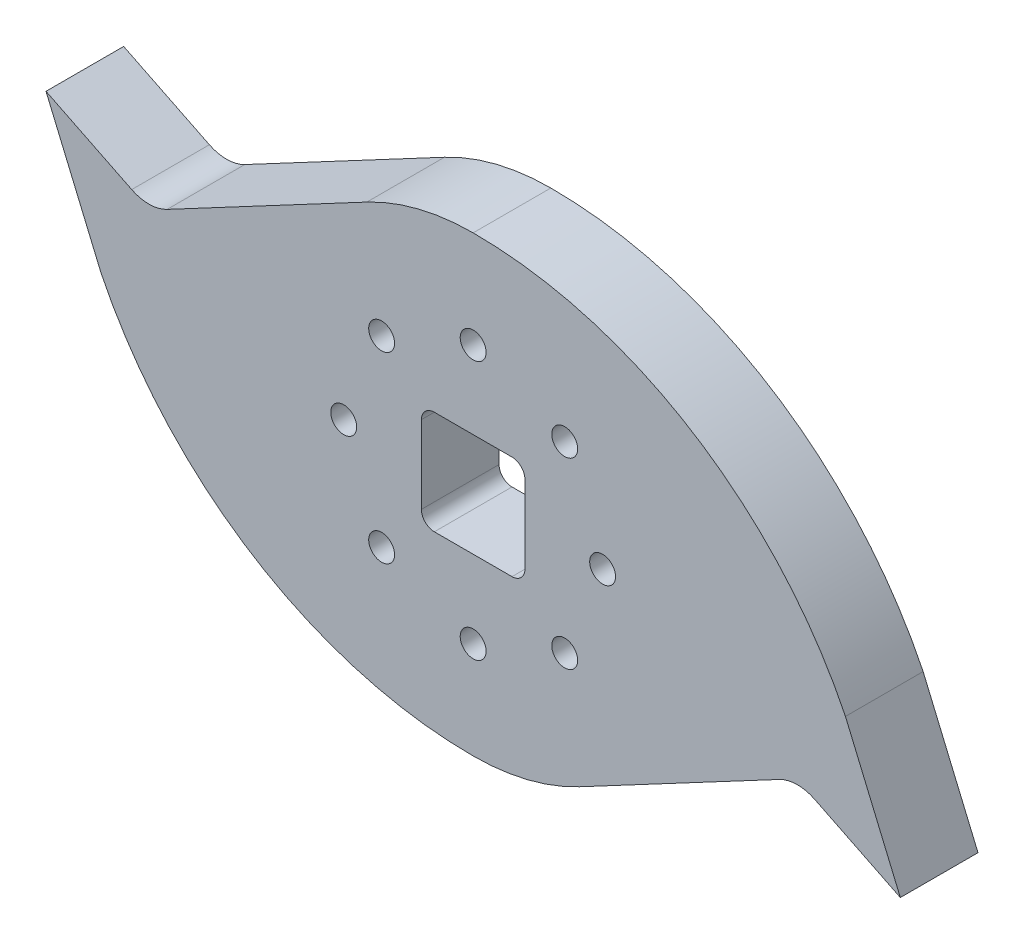
ISO-10303-21;
HEADER;
FILE_DESCRIPTION(('STEP AP214'),'2;1');
FILE_NAME('part.step','',(''),(''),'','','');
FILE_SCHEMA(('AUTOMOTIVE_DESIGN { 1 0 10303 214 1 1 1 1 }'));
ENDSEC;
DATA;
#1=APPLICATION_CONTEXT('core data for automotive mechanical design processes');
#2=APPLICATION_PROTOCOL_DEFINITION('international standard','automotive_design',2000,#1);
#3=PRODUCT_CONTEXT('',#1,'mechanical');
#4=PRODUCT('Part','Part','',(#3));
#5=PRODUCT_RELATED_PRODUCT_CATEGORY('part','',(#4));
#6=PRODUCT_DEFINITION_FORMATION('','',#4);
#7=PRODUCT_DEFINITION_CONTEXT('part definition',#1,'design');
#8=PRODUCT_DEFINITION('design','',#6,#7);
#9=PRODUCT_DEFINITION_SHAPE('','',#8);
#10=(LENGTH_UNIT() NAMED_UNIT(*) SI_UNIT(.MILLI.,.METRE.));
#11=(NAMED_UNIT(*) PLANE_ANGLE_UNIT() SI_UNIT($,.RADIAN.));
#12=(NAMED_UNIT(*) SI_UNIT($,.STERADIAN.) SOLID_ANGLE_UNIT());
#13=UNCERTAINTY_MEASURE_WITH_UNIT(LENGTH_MEASURE(1.E-05),#10,'distance_accuracy_value','');
#14=(GEOMETRIC_REPRESENTATION_CONTEXT(3) GLOBAL_UNCERTAINTY_ASSIGNED_CONTEXT((#13)) GLOBAL_UNIT_ASSIGNED_CONTEXT((#10,
#11,#12)) REPRESENTATION_CONTEXT('',''));
#15=CARTESIAN_POINT('',(0.,0.,0.));
#16=DIRECTION('',(0.,0.,1.));
#17=DIRECTION('',(1.,0.,0.));
#18=AXIS2_PLACEMENT_3D('',#15,#16,#17);
#19=CARTESIAN_POINT('',(0.,0.,6.));
#20=DIRECTION('',(0.,0.,1.));
#21=DIRECTION('',(1.,0.,0.));
#22=AXIS2_PLACEMENT_3D('',#19,#20,#21);
#23=PLANE('',#22);
#24=CARTESIAN_POINT('',(0.,10.,6.));
#25=DIRECTION('',(0.,0.,1.));
#26=DIRECTION('',(1.,0.,0.));
#27=AXIS2_PLACEMENT_3D('',#24,#25,#26);
#28=CIRCLE('',#27,1.);
#29=CARTESIAN_POINT('',(1.,10.,6.));
#30=VERTEX_POINT('',#29);
#31=EDGE_CURVE('E718',#30,#30,#28,.T.);
#32=ORIENTED_EDGE('',*,*,#31,.F.);
#33=EDGE_LOOP('',(#32));
#34=FACE_BOUND('',#33,.T.);
#35=CARTESIAN_POINT('',(7.0710678118656,7.07106781186578,6.));
#36=DIRECTION('',(0.,0.,1.));
#37=DIRECTION('',(1.,0.,0.));
#38=AXIS2_PLACEMENT_3D('',#35,#36,#37);
#39=CIRCLE('',#38,1.00000000000005);
#40=CARTESIAN_POINT('',(8.07106781186565,7.07106781186578,6.));
#41=VERTEX_POINT('',#40);
#42=EDGE_CURVE('E726',#41,#41,#39,.T.);
#43=ORIENTED_EDGE('',*,*,#42,.F.);
#44=EDGE_LOOP('',(#43));
#45=FACE_BOUND('',#44,.T.);
#46=CARTESIAN_POINT('',(10.0000000000004,4.24488671257339E-13,6.));
#47=DIRECTION('',(0.,0.,1.));
#48=DIRECTION('',(1.,0.,0.));
#49=AXIS2_PLACEMENT_3D('',#46,#47,#48);
#50=CIRCLE('',#49,1.00000000000032);
#51=CARTESIAN_POINT('',(11.0000000000007,4.24488671257339E-13,6.));
#52=VERTEX_POINT('',#51);
#53=EDGE_CURVE('E736',#52,#52,#50,.T.);
#54=ORIENTED_EDGE('',*,*,#53,.F.);
#55=EDGE_LOOP('',(#54));
#56=FACE_BOUND('',#55,.T.);
#57=CARTESIAN_POINT('',(7.0710678118662,-7.07106781186517,6.));
#58=DIRECTION('',(0.,0.,1.));
#59=DIRECTION('',(1.,0.,0.));
#60=AXIS2_PLACEMENT_3D('',#57,#58,#59);
#61=CIRCLE('',#60,1.00000000000066);
#62=CARTESIAN_POINT('',(8.07106781186686,-7.07106781186517,6.));
#63=VERTEX_POINT('',#62);
#64=EDGE_CURVE('E744',#63,#63,#61,.T.);
#65=ORIENTED_EDGE('',*,*,#64,.F.);
#66=EDGE_LOOP('',(#65));
#67=FACE_BOUND('',#66,.T.);
#68=CARTESIAN_POINT('',(8.48977342514678E-13,-10.,6.));
#69=DIRECTION('',(0.,0.,1.));
#70=DIRECTION('',(1.,0.,0.));
#71=AXIS2_PLACEMENT_3D('',#68,#69,#70);
#72=CIRCLE('',#71,1.00000000000088);
#73=CARTESIAN_POINT('',(1.00000000000173,-10.,6.));
#74=VERTEX_POINT('',#73);
#75=EDGE_CURVE('E752',#74,#74,#72,.T.);
#76=ORIENTED_EDGE('',*,*,#75,.F.);
#77=EDGE_LOOP('',(#76));
#78=FACE_BOUND('',#77,.T.);
#79=CARTESIAN_POINT('',(-7.07106781186475,-7.07106781186578,6.));
#80=DIRECTION('',(0.,0.,1.));
#81=DIRECTION('',(1.,0.,0.));
#82=AXIS2_PLACEMENT_3D('',#79,#80,#81);
#83=CIRCLE('',#82,1.00000000000086);
#84=CARTESIAN_POINT('',(-6.07106781186389,-7.07106781186578,6.));
#85=VERTEX_POINT('',#84);
#86=EDGE_CURVE('E760',#85,#85,#83,.T.);
#87=ORIENTED_EDGE('',*,*,#86,.F.);
#88=EDGE_LOOP('',(#87));
#89=FACE_BOUND('',#88,.T.);
#90=CARTESIAN_POINT('',(-9.99999999999958,-4.25713318056486E-13,6.));
#91=DIRECTION('',(0.,0.,1.));
#92=DIRECTION('',(1.,0.,0.));
#93=AXIS2_PLACEMENT_3D('',#90,#91,#92);
#94=CIRCLE('',#93,1.00000000000063);
#95=CARTESIAN_POINT('',(-8.99999999999895,-4.25713318056486E-13,6.));
#96=VERTEX_POINT('',#95);
#97=EDGE_CURVE('E768',#96,#96,#94,.T.);
#98=ORIENTED_EDGE('',*,*,#97,.F.);
#99=EDGE_LOOP('',(#98));
#100=FACE_BOUND('',#99,.T.);
#101=CARTESIAN_POINT('',(-7.07106781186535,7.07106781186517,6.));
#102=DIRECTION('',(0.,0.,1.));
#103=DIRECTION('',(1.,0.,0.));
#104=AXIS2_PLACEMENT_3D('',#101,#102,#103);
#105=CIRCLE('',#104,1.00000000000033);
#106=CARTESIAN_POINT('',(-6.07106781186503,7.07106781186517,6.));
#107=VERTEX_POINT('',#106);
#108=EDGE_CURVE('E775',#107,#107,#105,.T.);
#109=ORIENTED_EDGE('',*,*,#108,.F.);
#110=EDGE_LOOP('',(#109));
#111=FACE_BOUND('',#110,.T.);
#112=CARTESIAN_POINT('',(0.,0.,6.));
#113=DIRECTION('',(0.,0.,1.));
#114=DIRECTION('',(1.,0.,0.));
#115=AXIS2_PLACEMENT_3D('',#112,#113,#114);
#116=CIRCLE('',#115,17.5);
#117=CARTESIAN_POINT('',(0.,17.5,6.));
#118=VERTEX_POINT('',#117);
#119=CARTESIAN_POINT('',(-8.215752348753,15.4515828750313,6.));
#120=VERTEX_POINT('',#119);
#121=EDGE_CURVE('E270',#118,#120,#116,.T.);
#122=ORIENTED_EDGE('',*,*,#121,.T.);
#123=DIRECTION('',(-0.882947592858926,-0.469471562785892,0.));
#124=VECTOR('',#123,1.);
#125=CARTESIAN_POINT('',(-8.215752348753,15.4515828750313,6.));
#126=LINE('',#125,#124);
#127=CARTESIAN_POINT('',(-23.6433380172678,7.24859006731649,6.));
#128=VERTEX_POINT('',#127);
#129=EDGE_CURVE('E274',#120,#128,#126,.T.);
#130=ORIENTED_EDGE('',*,*,#129,.T.);
#131=CARTESIAN_POINT('',(-25.0517527056254,9.89743284589327,6.));
#132=DIRECTION('',(0.,0.,-1.));
#133=DIRECTION('',(-1.,0.,0.));
#134=AXIS2_PLACEMENT_3D('',#131,#132,#133);
#135=CIRCLE('',#134,3.);
#136=CARTESIAN_POINT('',(-26.3781712013609,7.20659394804545,6.));
#137=VERTEX_POINT('',#136);
#138=EDGE_CURVE('E278',#128,#137,#135,.T.);
#139=ORIENTED_EDGE('',*,*,#138,.T.);
#140=DIRECTION('',(-0.896946299282606,0.44213949857849,0.));
#141=VECTOR('',#140,1.);
#142=CARTESIAN_POINT('',(-33.,10.4707493016542,6.));
#143=LINE('',#142,#141);
#144=CARTESIAN_POINT('',(-33.,10.4707493016542,6.));
#145=VERTEX_POINT('',#144);
#146=EDGE_CURVE('E281',#137,#145,#143,.T.);
#147=ORIENTED_EDGE('',*,*,#146,.T.);
#148=DIRECTION('',(0.390302996190186,-0.920686467351923,0.));
#149=VECTOR('',#148,1.);
#150=CARTESIAN_POINT('',(-28.7607392958346,0.47074930165422,6.));
#151=LINE('',#150,#149);
#152=CARTESIAN_POINT('',(-28.7607392958346,0.47074930165421,6.));
#153=VERTEX_POINT('',#152);
#154=EDGE_CURVE('E284',#145,#153,#151,.T.);
#155=ORIENTED_EDGE('',*,*,#154,.T.);
#156=CARTESIAN_POINT('',(0.,14.5,6.));
#157=DIRECTION('',(0.,0.,1.));
#158=DIRECTION('',(-1.,0.,0.));
#159=AXIS2_PLACEMENT_3D('',#156,#157,#158);
#160=CIRCLE('',#159,32.);
#161=CARTESIAN_POINT('',(0.,-17.5,6.));
#162=VERTEX_POINT('',#161);
#163=EDGE_CURVE('E287',#153,#162,#160,.T.);
#164=ORIENTED_EDGE('',*,*,#163,.T.);
#165=CARTESIAN_POINT('',(0.,0.,6.));
#166=DIRECTION('',(0.,0.,1.));
#167=DIRECTION('',(1.,0.,0.));
#168=AXIS2_PLACEMENT_3D('',#165,#166,#167);
#169=CIRCLE('',#168,17.5);
#170=CARTESIAN_POINT('',(8.21575234875311,-15.4515828750312,6.));
#171=VERTEX_POINT('',#170);
#172=EDGE_CURVE('E290',#162,#171,#169,.T.);
#173=ORIENTED_EDGE('',*,*,#172,.T.);
#174=DIRECTION('',(0.882947592858926,0.469471562785892,0.));
#175=VECTOR('',#174,1.);
#176=CARTESIAN_POINT('',(8.21575234875311,-15.4515828750312,6.));
#177=LINE('',#176,#175);
#178=CARTESIAN_POINT('',(23.6433380172678,-7.24859006731649,6.));
#179=VERTEX_POINT('',#178);
#180=EDGE_CURVE('E293',#171,#179,#177,.T.);
#181=ORIENTED_EDGE('',*,*,#180,.T.);
#182=CARTESIAN_POINT('',(25.0517527056254,-9.89743284589327,6.));
#183=DIRECTION('',(0.,0.,-1.));
#184=DIRECTION('',(-1.,0.,0.));
#185=AXIS2_PLACEMENT_3D('',#182,#183,#184);
#186=CIRCLE('',#185,3.);
#187=CARTESIAN_POINT('',(26.3781712013609,-7.20659394804544,6.));
#188=VERTEX_POINT('',#187);
#189=EDGE_CURVE('E296',#179,#188,#186,.T.);
#190=ORIENTED_EDGE('',*,*,#189,.T.);
#191=DIRECTION('',(0.896946299282606,-0.442139498578489,0.));
#192=VECTOR('',#191,1.);
#193=CARTESIAN_POINT('',(33.,-10.4707493016542,6.));
#194=LINE('',#193,#192);
#195=CARTESIAN_POINT('',(33.,-10.4707493016542,6.));
#196=VERTEX_POINT('',#195);
#197=EDGE_CURVE('E299',#188,#196,#194,.T.);
#198=ORIENTED_EDGE('',*,*,#197,.T.);
#199=DIRECTION('',(-0.390302996190187,0.920686467351923,0.));
#200=VECTOR('',#199,1.);
#201=CARTESIAN_POINT('',(28.7607392958346,-0.470749301654217,6.));
#202=LINE('',#201,#200);
#203=CARTESIAN_POINT('',(28.7607392958346,-0.470749301654213,6.));
#204=VERTEX_POINT('',#203);
#205=EDGE_CURVE('E302',#196,#204,#202,.T.);
#206=ORIENTED_EDGE('',*,*,#205,.T.);
#207=CARTESIAN_POINT('',(0.,-14.5,6.));
#208=DIRECTION('',(0.,0.,1.));
#209=DIRECTION('',(-1.,0.,0.));
#210=AXIS2_PLACEMENT_3D('',#207,#208,#209);
#211=CIRCLE('',#210,32.);
#212=EDGE_CURVE('E305',#204,#118,#211,.T.);
#213=ORIENTED_EDGE('',*,*,#212,.T.);
#214=EDGE_LOOP('',(#122,#130,#139,#147,#155,#164,#173,#181,#190,#198,#206,#213));
#215=FACE_BOUND('',#214,.T.);
#216=DIRECTION('',(0.,1.,0.));
#217=VECTOR('',#216,1.);
#218=CARTESIAN_POINT('',(4.,-2.99999999999999,6.));
#219=LINE('',#218,#217);
#220=CARTESIAN_POINT('',(4.,-2.99999999999999,6.));
#221=VERTEX_POINT('',#220);
#222=CARTESIAN_POINT('',(4.,2.99999999999999,6.));
#223=VERTEX_POINT('',#222);
#224=EDGE_CURVE('E188',#221,#223,#219,.T.);
#225=ORIENTED_EDGE('',*,*,#224,.F.);
#226=CARTESIAN_POINT('',(3.,-3.,6.));
#227=DIRECTION('',(0.,0.,1.));
#228=DIRECTION('',(1.,0.,0.));
#229=AXIS2_PLACEMENT_3D('',#226,#227,#228);
#230=CIRCLE('',#229,1.);
#231=CARTESIAN_POINT('',(2.99999999999999,-4.,6.));
#232=VERTEX_POINT('',#231);
#233=EDGE_CURVE('E179',#232,#221,#230,.T.);
#234=ORIENTED_EDGE('',*,*,#233,.F.);
#235=DIRECTION('',(1.,0.,0.));
#236=VECTOR('',#235,1.);
#237=CARTESIAN_POINT('',(-2.99999999999999,-4.,6.));
#238=LINE('',#237,#236);
#239=CARTESIAN_POINT('',(-2.99999999999999,-4.,6.));
#240=VERTEX_POINT('',#239);
#241=EDGE_CURVE('E221',#240,#232,#238,.T.);
#242=ORIENTED_EDGE('',*,*,#241,.F.);
#243=CARTESIAN_POINT('',(-3.,-3.,6.));
#244=DIRECTION('',(0.,0.,1.));
#245=DIRECTION('',(1.,0.,0.));
#246=AXIS2_PLACEMENT_3D('',#243,#244,#245);
#247=CIRCLE('',#246,1.);
#248=CARTESIAN_POINT('',(-4.,-2.99999999999999,6.));
#249=VERTEX_POINT('',#248);
#250=EDGE_CURVE('E218',#249,#240,#247,.T.);
#251=ORIENTED_EDGE('',*,*,#250,.F.);
#252=DIRECTION('',(0.,-1.,0.));
#253=VECTOR('',#252,1.);
#254=CARTESIAN_POINT('',(-4.,-2.99999999999999,6.));
#255=LINE('',#254,#253);
#256=CARTESIAN_POINT('',(-4.,2.99999999999999,6.));
#257=VERTEX_POINT('',#256);
#258=EDGE_CURVE('E215',#257,#249,#255,.T.);
#259=ORIENTED_EDGE('',*,*,#258,.F.);
#260=CARTESIAN_POINT('',(-3.,3.,6.));
#261=DIRECTION('',(0.,0.,1.));
#262=DIRECTION('',(-1.,0.,0.));
#263=AXIS2_PLACEMENT_3D('',#260,#261,#262);
#264=CIRCLE('',#263,1.);
#265=CARTESIAN_POINT('',(-2.99999999999999,4.,6.));
#266=VERTEX_POINT('',#265);
#267=EDGE_CURVE('E212',#266,#257,#264,.T.);
#268=ORIENTED_EDGE('',*,*,#267,.F.);
#269=DIRECTION('',(-1.,0.,0.));
#270=VECTOR('',#269,1.);
#271=CARTESIAN_POINT('',(-2.99999999999999,4.,6.));
#272=LINE('',#271,#270);
#273=CARTESIAN_POINT('',(2.99999999999999,4.,6.));
#274=VERTEX_POINT('',#273);
#275=EDGE_CURVE('E206',#274,#266,#272,.T.);
#276=ORIENTED_EDGE('',*,*,#275,.F.);
#277=CARTESIAN_POINT('',(3.,3.,6.));
#278=DIRECTION('',(0.,0.,1.));
#279=DIRECTION('',(1.,0.,0.));
#280=AXIS2_PLACEMENT_3D('',#277,#278,#279);
#281=CIRCLE('',#280,1.);
#282=EDGE_CURVE('E202',#223,#274,#281,.T.);
#283=ORIENTED_EDGE('',*,*,#282,.F.);
#284=EDGE_LOOP('',(#225,#234,#242,#251,#259,#268,#276,#283));
#285=FACE_BOUND('',#284,.T.);
#286=ADVANCED_FACE('F41',(#34,#45,#56,#67,#78,#89,#100,#111,#215,#285),#23,.T.);
#287=CARTESIAN_POINT('',(0.,0.,0.));
#288=DIRECTION('',(0.,0.,1.));
#289=DIRECTION('',(1.,0.,0.));
#290=AXIS2_PLACEMENT_3D('',#287,#288,#289);
#291=PLANE('',#290);
#292=CARTESIAN_POINT('',(0.,10.,0.));
#293=DIRECTION('',(0.,0.,1.));
#294=DIRECTION('',(1.,0.,0.));
#295=AXIS2_PLACEMENT_3D('',#292,#293,#294);
#296=CIRCLE('',#295,1.);
#297=CARTESIAN_POINT('',(1.,10.,0.));
#298=VERTEX_POINT('',#297);
#299=EDGE_CURVE('E226',#298,#298,#296,.T.);
#300=ORIENTED_EDGE('',*,*,#299,.T.);
#301=EDGE_LOOP('',(#300));
#302=FACE_BOUND('',#301,.T.);
#303=CARTESIAN_POINT('',(7.0710678118656,7.07106781186578,0.));
#304=DIRECTION('',(0.,0.,1.));
#305=DIRECTION('',(1.,0.,0.));
#306=AXIS2_PLACEMENT_3D('',#303,#304,#305);
#307=CIRCLE('',#306,1.00000000000005);
#308=CARTESIAN_POINT('',(8.07106781186565,7.07106781186578,0.));
#309=VERTEX_POINT('',#308);
#310=EDGE_CURVE('E720',#309,#309,#307,.T.);
#311=ORIENTED_EDGE('',*,*,#310,.T.);
#312=EDGE_LOOP('',(#311));
#313=FACE_BOUND('',#312,.T.);
#314=CARTESIAN_POINT('',(10.0000000000004,4.24488671257339E-13,0.));
#315=DIRECTION('',(0.,0.,1.));
#316=DIRECTION('',(1.,0.,0.));
#317=AXIS2_PLACEMENT_3D('',#314,#315,#316);
#318=CIRCLE('',#317,1.00000000000032);
#319=CARTESIAN_POINT('',(11.0000000000007,4.24488671257339E-13,0.));
#320=VERTEX_POINT('',#319);
#321=EDGE_CURVE('E732',#320,#320,#318,.T.);
#322=ORIENTED_EDGE('',*,*,#321,.T.);
#323=EDGE_LOOP('',(#322));
#324=FACE_BOUND('',#323,.T.);
#325=CARTESIAN_POINT('',(7.0710678118662,-7.07106781186517,0.));
#326=DIRECTION('',(0.,0.,1.));
#327=DIRECTION('',(1.,0.,0.));
#328=AXIS2_PLACEMENT_3D('',#325,#326,#327);
#329=CIRCLE('',#328,1.00000000000066);
#330=CARTESIAN_POINT('',(8.07106781186686,-7.07106781186517,0.));
#331=VERTEX_POINT('',#330);
#332=EDGE_CURVE('E740',#331,#331,#329,.T.);
#333=ORIENTED_EDGE('',*,*,#332,.T.);
#334=EDGE_LOOP('',(#333));
#335=FACE_BOUND('',#334,.T.);
#336=CARTESIAN_POINT('',(8.48977342514678E-13,-10.,0.));
#337=DIRECTION('',(0.,0.,1.));
#338=DIRECTION('',(1.,0.,0.));
#339=AXIS2_PLACEMENT_3D('',#336,#337,#338);
#340=CIRCLE('',#339,1.00000000000088);
#341=CARTESIAN_POINT('',(1.00000000000173,-10.,0.));
#342=VERTEX_POINT('',#341);
#343=EDGE_CURVE('E748',#342,#342,#340,.T.);
#344=ORIENTED_EDGE('',*,*,#343,.T.);
#345=EDGE_LOOP('',(#344));
#346=FACE_BOUND('',#345,.T.);
#347=CARTESIAN_POINT('',(-7.07106781186475,-7.07106781186578,0.));
#348=DIRECTION('',(0.,0.,1.));
#349=DIRECTION('',(1.,0.,0.));
#350=AXIS2_PLACEMENT_3D('',#347,#348,#349);
#351=CIRCLE('',#350,1.00000000000086);
#352=CARTESIAN_POINT('',(-6.07106781186389,-7.07106781186578,0.));
#353=VERTEX_POINT('',#352);
#354=EDGE_CURVE('E756',#353,#353,#351,.T.);
#355=ORIENTED_EDGE('',*,*,#354,.T.);
#356=EDGE_LOOP('',(#355));
#357=FACE_BOUND('',#356,.T.);
#358=CARTESIAN_POINT('',(-9.99999999999958,-4.25713318056486E-13,0.));
#359=DIRECTION('',(0.,0.,1.));
#360=DIRECTION('',(1.,0.,0.));
#361=AXIS2_PLACEMENT_3D('',#358,#359,#360);
#362=CIRCLE('',#361,1.00000000000063);
#363=CARTESIAN_POINT('',(-8.99999999999895,-4.25713318056486E-13,0.));
#364=VERTEX_POINT('',#363);
#365=EDGE_CURVE('E764',#364,#364,#362,.T.);
#366=ORIENTED_EDGE('',*,*,#365,.T.);
#367=EDGE_LOOP('',(#366));
#368=FACE_BOUND('',#367,.T.);
#369=CARTESIAN_POINT('',(-7.07106781186535,7.07106781186517,0.));
#370=DIRECTION('',(0.,0.,1.));
#371=DIRECTION('',(1.,0.,0.));
#372=AXIS2_PLACEMENT_3D('',#369,#370,#371);
#373=CIRCLE('',#372,1.00000000000033);
#374=CARTESIAN_POINT('',(-6.07106781186503,7.07106781186517,0.));
#375=VERTEX_POINT('',#374);
#376=EDGE_CURVE('E772',#375,#375,#373,.T.);
#377=ORIENTED_EDGE('',*,*,#376,.T.);
#378=EDGE_LOOP('',(#377));
#379=FACE_BOUND('',#378,.T.);
#380=CARTESIAN_POINT('',(0.,0.,0.));
#381=DIRECTION('',(0.,0.,1.));
#382=DIRECTION('',(1.,0.,0.));
#383=AXIS2_PLACEMENT_3D('',#380,#381,#382);
#384=CIRCLE('',#383,17.5);
#385=CARTESIAN_POINT('',(0.,17.5,0.));
#386=VERTEX_POINT('',#385);
#387=CARTESIAN_POINT('',(-8.215752348753,15.4515828750313,0.));
#388=VERTEX_POINT('',#387);
#389=EDGE_CURVE('E197',#386,#388,#384,.T.);
#390=ORIENTED_EDGE('',*,*,#389,.F.);
#391=CARTESIAN_POINT('',(0.,-14.5,0.));
#392=DIRECTION('',(0.,0.,1.));
#393=DIRECTION('',(-1.,0.,0.));
#394=AXIS2_PLACEMENT_3D('',#391,#392,#393);
#395=CIRCLE('',#394,32.);
#396=CARTESIAN_POINT('',(28.7607392958346,-0.470749301654213,0.));
#397=VERTEX_POINT('',#396);
#398=EDGE_CURVE('E275',#397,#386,#395,.T.);
#399=ORIENTED_EDGE('',*,*,#398,.F.);
#400=DIRECTION('',(-0.390302996190187,0.920686467351923,0.));
#401=VECTOR('',#400,1.);
#402=CARTESIAN_POINT('',(28.7607392958346,-0.470749301654217,0.));
#403=LINE('',#402,#401);
#404=CARTESIAN_POINT('',(33.,-10.4707493016542,0.));
#405=VERTEX_POINT('',#404);
#406=EDGE_CURVE('E339',#405,#397,#403,.T.);
#407=ORIENTED_EDGE('',*,*,#406,.F.);
#408=DIRECTION('',(0.896946299282606,-0.442139498578489,0.));
#409=VECTOR('',#408,1.);
#410=CARTESIAN_POINT('',(33.,-10.4707493016542,0.));
#411=LINE('',#410,#409);
#412=CARTESIAN_POINT('',(26.3781712013609,-7.20659394804544,0.));
#413=VERTEX_POINT('',#412);
#414=EDGE_CURVE('E336',#413,#405,#411,.T.);
#415=ORIENTED_EDGE('',*,*,#414,.F.);
#416=CARTESIAN_POINT('',(25.0517527056254,-9.89743284589327,0.));
#417=DIRECTION('',(0.,0.,-1.));
#418=DIRECTION('',(-1.,0.,0.));
#419=AXIS2_PLACEMENT_3D('',#416,#417,#418);
#420=CIRCLE('',#419,3.);
#421=CARTESIAN_POINT('',(23.6433380172678,-7.24859006731649,0.));
#422=VERTEX_POINT('',#421);
#423=EDGE_CURVE('E333',#422,#413,#420,.T.);
#424=ORIENTED_EDGE('',*,*,#423,.F.);
#425=DIRECTION('',(0.882947592858926,0.469471562785892,0.));
#426=VECTOR('',#425,1.);
#427=CARTESIAN_POINT('',(8.21575234875311,-15.4515828750312,0.));
#428=LINE('',#427,#426);
#429=CARTESIAN_POINT('',(8.21575234875311,-15.4515828750312,0.));
#430=VERTEX_POINT('',#429);
#431=EDGE_CURVE('E330',#430,#422,#428,.T.);
#432=ORIENTED_EDGE('',*,*,#431,.F.);
#433=CARTESIAN_POINT('',(0.,0.,0.));
#434=DIRECTION('',(0.,0.,1.));
#435=DIRECTION('',(1.,0.,0.));
#436=AXIS2_PLACEMENT_3D('',#433,#434,#435);
#437=CIRCLE('',#436,17.5);
#438=CARTESIAN_POINT('',(0.,-17.5,0.));
#439=VERTEX_POINT('',#438);
#440=EDGE_CURVE('E327',#439,#430,#437,.T.);
#441=ORIENTED_EDGE('',*,*,#440,.F.);
#442=CARTESIAN_POINT('',(0.,14.5,0.));
#443=DIRECTION('',(0.,0.,1.));
#444=DIRECTION('',(-1.,0.,0.));
#445=AXIS2_PLACEMENT_3D('',#442,#443,#444);
#446=CIRCLE('',#445,32.);
#447=CARTESIAN_POINT('',(-28.7607392958346,0.47074930165421,0.));
#448=VERTEX_POINT('',#447);
#449=EDGE_CURVE('E324',#448,#439,#446,.T.);
#450=ORIENTED_EDGE('',*,*,#449,.F.);
#451=DIRECTION('',(0.390302996190186,-0.920686467351923,0.));
#452=VECTOR('',#451,1.);
#453=CARTESIAN_POINT('',(-28.7607392958346,0.47074930165422,0.));
#454=LINE('',#453,#452);
#455=CARTESIAN_POINT('',(-33.,10.4707493016542,0.));
#456=VERTEX_POINT('',#455);
#457=EDGE_CURVE('E321',#456,#448,#454,.T.);
#458=ORIENTED_EDGE('',*,*,#457,.F.);
#459=DIRECTION('',(-0.896946299282606,0.44213949857849,0.));
#460=VECTOR('',#459,1.);
#461=CARTESIAN_POINT('',(-33.,10.4707493016542,0.));
#462=LINE('',#461,#460);
#463=CARTESIAN_POINT('',(-26.3781712013609,7.20659394804545,0.));
#464=VERTEX_POINT('',#463);
#465=EDGE_CURVE('E318',#464,#456,#462,.T.);
#466=ORIENTED_EDGE('',*,*,#465,.F.);
#467=CARTESIAN_POINT('',(-25.0517527056254,9.89743284589327,0.));
#468=DIRECTION('',(0.,0.,-1.));
#469=DIRECTION('',(-1.,0.,0.));
#470=AXIS2_PLACEMENT_3D('',#467,#468,#469);
#471=CIRCLE('',#470,3.);
#472=CARTESIAN_POINT('',(-23.6433380172678,7.24859006731649,0.));
#473=VERTEX_POINT('',#472);
#474=EDGE_CURVE('E315',#473,#464,#471,.T.);
#475=ORIENTED_EDGE('',*,*,#474,.F.);
#476=DIRECTION('',(-0.882947592858926,-0.469471562785892,0.));
#477=VECTOR('',#476,1.);
#478=CARTESIAN_POINT('',(-8.215752348753,15.4515828750313,0.));
#479=LINE('',#478,#477);
#480=EDGE_CURVE('E312',#388,#473,#479,.T.);
#481=ORIENTED_EDGE('',*,*,#480,.F.);
#482=EDGE_LOOP('',(#390,#399,#407,#415,#424,#432,#441,#450,#458,#466,#475,#481));
#483=FACE_BOUND('',#482,.T.);
#484=CARTESIAN_POINT('',(3.,-3.,0.));
#485=DIRECTION('',(0.,0.,1.));
#486=DIRECTION('',(1.,0.,0.));
#487=AXIS2_PLACEMENT_3D('',#484,#485,#486);
#488=CIRCLE('',#487,1.);
#489=CARTESIAN_POINT('',(2.99999999999999,-4.,0.));
#490=VERTEX_POINT('',#489);
#491=CARTESIAN_POINT('',(4.,-2.99999999999999,0.));
#492=VERTEX_POINT('',#491);
#493=EDGE_CURVE('E65',#490,#492,#488,.T.);
#494=ORIENTED_EDGE('',*,*,#493,.T.);
#495=DIRECTION('',(0.,1.,0.));
#496=VECTOR('',#495,1.);
#497=CARTESIAN_POINT('',(4.,-2.99999999999999,0.));
#498=LINE('',#497,#496);
#499=CARTESIAN_POINT('',(4.,2.99999999999999,0.));
#500=VERTEX_POINT('',#499);
#501=EDGE_CURVE('E195',#492,#500,#498,.T.);
#502=ORIENTED_EDGE('',*,*,#501,.T.);
#503=CARTESIAN_POINT('',(3.,3.,0.));
#504=DIRECTION('',(0.,0.,1.));
#505=DIRECTION('',(1.,0.,0.));
#506=AXIS2_PLACEMENT_3D('',#503,#504,#505);
#507=CIRCLE('',#506,1.);
#508=CARTESIAN_POINT('',(2.99999999999999,4.,0.));
#509=VERTEX_POINT('',#508);
#510=EDGE_CURVE('E229',#500,#509,#507,.T.);
#511=ORIENTED_EDGE('',*,*,#510,.T.);
#512=DIRECTION('',(-1.,0.,0.));
#513=VECTOR('',#512,1.);
#514=CARTESIAN_POINT('',(-2.99999999999999,4.,0.));
#515=LINE('',#514,#513);
#516=CARTESIAN_POINT('',(-2.99999999999999,4.,0.));
#517=VERTEX_POINT('',#516);
#518=EDGE_CURVE('E233',#509,#517,#515,.T.);
#519=ORIENTED_EDGE('',*,*,#518,.T.);
#520=CARTESIAN_POINT('',(-3.,3.,0.));
#521=DIRECTION('',(0.,0.,1.));
#522=DIRECTION('',(-1.,0.,0.));
#523=AXIS2_PLACEMENT_3D('',#520,#521,#522);
#524=CIRCLE('',#523,1.);
#525=CARTESIAN_POINT('',(-4.,2.99999999999999,0.));
#526=VERTEX_POINT('',#525);
#527=EDGE_CURVE('E237',#517,#526,#524,.T.);
#528=ORIENTED_EDGE('',*,*,#527,.T.);
#529=DIRECTION('',(0.,-1.,0.));
#530=VECTOR('',#529,1.);
#531=CARTESIAN_POINT('',(-4.,-2.99999999999999,0.));
#532=LINE('',#531,#530);
#533=CARTESIAN_POINT('',(-4.,-2.99999999999999,0.));
#534=VERTEX_POINT('',#533);
#535=EDGE_CURVE('E241',#526,#534,#532,.T.);
#536=ORIENTED_EDGE('',*,*,#535,.T.);
#537=CARTESIAN_POINT('',(-3.,-3.,0.));
#538=DIRECTION('',(0.,0.,1.));
#539=DIRECTION('',(1.,0.,0.));
#540=AXIS2_PLACEMENT_3D('',#537,#538,#539);
#541=CIRCLE('',#540,1.);
#542=CARTESIAN_POINT('',(-2.99999999999999,-4.,0.));
#543=VERTEX_POINT('',#542);
#544=EDGE_CURVE('E245',#534,#543,#541,.T.);
#545=ORIENTED_EDGE('',*,*,#544,.T.);
#546=DIRECTION('',(1.,0.,0.));
#547=VECTOR('',#546,1.);
#548=CARTESIAN_POINT('',(-2.99999999999999,-4.,0.));
#549=LINE('',#548,#547);
#550=EDGE_CURVE('E189',#543,#490,#549,.T.);
#551=ORIENTED_EDGE('',*,*,#550,.T.);
#552=EDGE_LOOP('',(#494,#502,#511,#519,#528,#536,#545,#551));
#553=FACE_BOUND('',#552,.T.);
#554=ADVANCED_FACE('F394',(#302,#313,#324,#335,#346,#357,#368,#379,#483,#553),#291,.F.);
#555=CARTESIAN_POINT('',(0.,0.,6.));
#556=DIRECTION('',(0.,0.,-1.));
#557=DIRECTION('',(-1.,0.,0.));
#558=AXIS2_PLACEMENT_3D('',#555,#556,#557);
#559=CYLINDRICAL_SURFACE('',#558,17.5);
#560=ORIENTED_EDGE('',*,*,#389,.T.);
#561=DIRECTION('',(0.,0.,-1.));
#562=VECTOR('',#561,1.);
#563=CARTESIAN_POINT('',(-8.215752348753,15.4515828750313,6.));
#564=LINE('',#563,#562);
#565=EDGE_CURVE('E11',#120,#388,#564,.T.);
#566=ORIENTED_EDGE('',*,*,#565,.F.);
#567=ORIENTED_EDGE('',*,*,#121,.F.);
#568=DIRECTION('',(0.,0.,-1.));
#569=VECTOR('',#568,1.);
#570=CARTESIAN_POINT('',(0.,17.5,6.));
#571=LINE('',#570,#569);
#572=EDGE_CURVE('E308',#118,#386,#571,.T.);
#573=ORIENTED_EDGE('',*,*,#572,.T.);
#574=EDGE_LOOP('',(#560,#566,#567,#573));
#575=FACE_BOUND('',#574,.T.);
#576=ADVANCED_FACE('F43',(#575),#559,.T.);
#577=CARTESIAN_POINT('',(-8.215752348753,15.4515828750313,6.));
#578=DIRECTION('',(0.469471562785892,-0.882947592858926,0.));
#579=DIRECTION('',(0.882947592858927,0.469471562785892,0.));
#580=AXIS2_PLACEMENT_3D('',#577,#578,#579);
#581=PLANE('',#580);
#582=ORIENTED_EDGE('',*,*,#480,.T.);
#583=DIRECTION('',(0.,0.,-1.));
#584=VECTOR('',#583,1.);
#585=CARTESIAN_POINT('',(-23.6433380172678,7.24859006731649,6.));
#586=LINE('',#585,#584);
#587=EDGE_CURVE('E50',#128,#473,#586,.T.);
#588=ORIENTED_EDGE('',*,*,#587,.F.);
#589=ORIENTED_EDGE('',*,*,#129,.F.);
#590=ORIENTED_EDGE('',*,*,#565,.T.);
#591=EDGE_LOOP('',(#582,#588,#589,#590));
#592=FACE_BOUND('',#591,.T.);
#593=ADVANCED_FACE('F411',(#592),#581,.F.);
#594=CARTESIAN_POINT('',(-25.0517527056254,9.89743284589327,6.));
#595=DIRECTION('',(0.,0.,-1.));
#596=DIRECTION('',(-1.,0.,0.));
#597=AXIS2_PLACEMENT_3D('',#594,#595,#596);
#598=CYLINDRICAL_SURFACE('',#597,3.);
#599=ORIENTED_EDGE('',*,*,#474,.T.);
#600=DIRECTION('',(0.,0.,-1.));
#601=VECTOR('',#600,1.);
#602=CARTESIAN_POINT('',(-26.3781712013609,7.20659394804545,6.));
#603=LINE('',#602,#601);
#604=EDGE_CURVE('E379',#137,#464,#603,.T.);
#605=ORIENTED_EDGE('',*,*,#604,.F.);
#606=ORIENTED_EDGE('',*,*,#138,.F.);
#607=ORIENTED_EDGE('',*,*,#587,.T.);
#608=EDGE_LOOP('',(#599,#605,#606,#607));
#609=FACE_BOUND('',#608,.T.);
#610=ADVANCED_FACE('F388',(#609),#598,.F.);
#611=CARTESIAN_POINT('',(-33.,10.4707493016542,6.));
#612=DIRECTION('',(-0.44213949857849,-0.896946299282606,0.));
#613=DIRECTION('',(0.896946299282606,-0.44213949857849,0.));
#614=AXIS2_PLACEMENT_3D('',#611,#612,#613);
#615=PLANE('',#614);
#616=ORIENTED_EDGE('',*,*,#465,.T.);
#617=DIRECTION('',(0.,0.,-1.));
#618=VECTOR('',#617,1.);
#619=CARTESIAN_POINT('',(-33.,10.4707493016542,6.));
#620=LINE('',#619,#618);
#621=EDGE_CURVE('E375',#145,#456,#620,.T.);
#622=ORIENTED_EDGE('',*,*,#621,.F.);
#623=ORIENTED_EDGE('',*,*,#146,.F.);
#624=ORIENTED_EDGE('',*,*,#604,.T.);
#625=EDGE_LOOP('',(#616,#622,#623,#624));
#626=FACE_BOUND('',#625,.T.);
#627=ADVANCED_FACE('F400',(#626),#615,.F.);
#628=CARTESIAN_POINT('',(-28.7607392958346,0.47074930165422,6.));
#629=DIRECTION('',(0.920686467351923,0.390302996190186,0.));
#630=DIRECTION('',(-0.390302996190186,0.920686467351923,0.));
#631=AXIS2_PLACEMENT_3D('',#628,#629,#630);
#632=PLANE('',#631);
#633=ORIENTED_EDGE('',*,*,#457,.T.);
#634=DIRECTION('',(0.,0.,-1.));
#635=VECTOR('',#634,1.);
#636=CARTESIAN_POINT('',(-28.7607392958346,0.47074930165421,6.));
#637=LINE('',#636,#635);
#638=EDGE_CURVE('E371',#153,#448,#637,.T.);
#639=ORIENTED_EDGE('',*,*,#638,.F.);
#640=ORIENTED_EDGE('',*,*,#154,.F.);
#641=ORIENTED_EDGE('',*,*,#621,.T.);
#642=EDGE_LOOP('',(#633,#639,#640,#641));
#643=FACE_BOUND('',#642,.T.);
#644=ADVANCED_FACE('F404',(#643),#632,.F.);
#645=CARTESIAN_POINT('',(0.,14.5,6.));
#646=DIRECTION('',(0.,0.,-1.));
#647=DIRECTION('',(-1.,0.,0.));
#648=AXIS2_PLACEMENT_3D('',#645,#646,#647);
#649=CYLINDRICAL_SURFACE('',#648,32.);
#650=ORIENTED_EDGE('',*,*,#449,.T.);
#651=DIRECTION('',(0.,0.,-1.));
#652=VECTOR('',#651,1.);
#653=CARTESIAN_POINT('',(0.,-17.5,6.));
#654=LINE('',#653,#652);
#655=EDGE_CURVE('E367',#162,#439,#654,.T.);
#656=ORIENTED_EDGE('',*,*,#655,.F.);
#657=ORIENTED_EDGE('',*,*,#163,.F.);
#658=ORIENTED_EDGE('',*,*,#638,.T.);
#659=EDGE_LOOP('',(#650,#656,#657,#658));
#660=FACE_BOUND('',#659,.T.);
#661=ADVANCED_FACE('F444',(#660),#649,.T.);
#662=CARTESIAN_POINT('',(0.,0.,6.));
#663=DIRECTION('',(0.,0.,-1.));
#664=DIRECTION('',(-1.,0.,0.));
#665=AXIS2_PLACEMENT_3D('',#662,#663,#664);
#666=CYLINDRICAL_SURFACE('',#665,17.5);
#667=ORIENTED_EDGE('',*,*,#440,.T.);
#668=DIRECTION('',(0.,0.,-1.));
#669=VECTOR('',#668,1.);
#670=CARTESIAN_POINT('',(8.21575234875311,-15.4515828750312,6.));
#671=LINE('',#670,#669);
#672=EDGE_CURVE('E363',#171,#430,#671,.T.);
#673=ORIENTED_EDGE('',*,*,#672,.F.);
#674=ORIENTED_EDGE('',*,*,#172,.F.);
#675=ORIENTED_EDGE('',*,*,#655,.T.);
#676=EDGE_LOOP('',(#667,#673,#674,#675));
#677=FACE_BOUND('',#676,.T.);
#678=ADVANCED_FACE('F442',(#677),#666,.T.);
#679=CARTESIAN_POINT('',(8.21575234875311,-15.4515828750312,6.));
#680=DIRECTION('',(-0.469471562785892,0.882947592858926,0.));
#681=DIRECTION('',(-0.882947592858926,-0.469471562785892,0.));
#682=AXIS2_PLACEMENT_3D('',#679,#680,#681);
#683=PLANE('',#682);
#684=ORIENTED_EDGE('',*,*,#431,.T.);
#685=DIRECTION('',(0.,0.,-1.));
#686=VECTOR('',#685,1.);
#687=CARTESIAN_POINT('',(23.6433380172678,-7.24859006731649,6.));
#688=LINE('',#687,#686);
#689=EDGE_CURVE('E359',#179,#422,#688,.T.);
#690=ORIENTED_EDGE('',*,*,#689,.F.);
#691=ORIENTED_EDGE('',*,*,#180,.F.);
#692=ORIENTED_EDGE('',*,*,#672,.T.);
#693=EDGE_LOOP('',(#684,#690,#691,#692));
#694=FACE_BOUND('',#693,.T.);
#695=ADVANCED_FACE('F438',(#694),#683,.F.);
#696=CARTESIAN_POINT('',(25.0517527056254,-9.89743284589327,6.));
#697=DIRECTION('',(0.,0.,-1.));
#698=DIRECTION('',(-1.,0.,0.));
#699=AXIS2_PLACEMENT_3D('',#696,#697,#698);
#700=CYLINDRICAL_SURFACE('',#699,3.);
#701=ORIENTED_EDGE('',*,*,#423,.T.);
#702=DIRECTION('',(0.,0.,-1.));
#703=VECTOR('',#702,1.);
#704=CARTESIAN_POINT('',(26.3781712013609,-7.20659394804544,6.));
#705=LINE('',#704,#703);
#706=EDGE_CURVE('E355',#188,#413,#705,.T.);
#707=ORIENTED_EDGE('',*,*,#706,.F.);
#708=ORIENTED_EDGE('',*,*,#189,.F.);
#709=ORIENTED_EDGE('',*,*,#689,.T.);
#710=EDGE_LOOP('',(#701,#707,#708,#709));
#711=FACE_BOUND('',#710,.T.);
#712=ADVANCED_FACE('F433',(#711),#700,.F.);
#713=CARTESIAN_POINT('',(33.,-10.4707493016542,6.));
#714=DIRECTION('',(0.442139498578489,0.896946299282606,0.));
#715=DIRECTION('',(-0.896946299282606,0.442139498578489,0.));
#716=AXIS2_PLACEMENT_3D('',#713,#714,#715);
#717=PLANE('',#716);
#718=ORIENTED_EDGE('',*,*,#414,.T.);
#719=DIRECTION('',(0.,0.,-1.));
#720=VECTOR('',#719,1.);
#721=CARTESIAN_POINT('',(33.,-10.4707493016542,6.));
#722=LINE('',#721,#720);
#723=EDGE_CURVE('E351',#196,#405,#722,.T.);
#724=ORIENTED_EDGE('',*,*,#723,.F.);
#725=ORIENTED_EDGE('',*,*,#197,.F.);
#726=ORIENTED_EDGE('',*,*,#706,.T.);
#727=EDGE_LOOP('',(#718,#724,#725,#726));
#728=FACE_BOUND('',#727,.T.);
#729=ADVANCED_FACE('F427',(#728),#717,.F.);
#730=CARTESIAN_POINT('',(28.7607392958346,-0.470749301654217,6.));
#731=DIRECTION('',(-0.920686467351923,-0.390302996190186,0.));
#732=DIRECTION('',(0.390302996190187,-0.920686467351923,0.));
#733=AXIS2_PLACEMENT_3D('',#730,#731,#732);
#734=PLANE('',#733);
#735=ORIENTED_EDGE('',*,*,#406,.T.);
#736=DIRECTION('',(0.,0.,-1.));
#737=VECTOR('',#736,1.);
#738=CARTESIAN_POINT('',(28.7607392958346,-0.470749301654213,6.));
#739=LINE('',#738,#737);
#740=EDGE_CURVE('E347',#204,#397,#739,.T.);
#741=ORIENTED_EDGE('',*,*,#740,.F.);
#742=ORIENTED_EDGE('',*,*,#205,.F.);
#743=ORIENTED_EDGE('',*,*,#723,.T.);
#744=EDGE_LOOP('',(#735,#741,#742,#743));
#745=FACE_BOUND('',#744,.T.);
#746=ADVANCED_FACE('F423',(#745),#734,.F.);
#747=CARTESIAN_POINT('',(0.,-14.5,6.));
#748=DIRECTION('',(0.,0.,-1.));
#749=DIRECTION('',(-1.,0.,0.));
#750=AXIS2_PLACEMENT_3D('',#747,#748,#749);
#751=CYLINDRICAL_SURFACE('',#750,32.);
#752=ORIENTED_EDGE('',*,*,#398,.T.);
#753=ORIENTED_EDGE('',*,*,#572,.F.);
#754=ORIENTED_EDGE('',*,*,#212,.F.);
#755=ORIENTED_EDGE('',*,*,#740,.T.);
#756=EDGE_LOOP('',(#752,#753,#754,#755));
#757=FACE_BOUND('',#756,.T.);
#758=ADVANCED_FACE('F418',(#757),#751,.T.);
#759=CARTESIAN_POINT('',(3.,-3.,6.));
#760=DIRECTION('',(0.,0.,-1.));
#761=DIRECTION('',(-1.,0.,0.));
#762=AXIS2_PLACEMENT_3D('',#759,#760,#761);
#763=CYLINDRICAL_SURFACE('',#762,1.);
#764=ORIENTED_EDGE('',*,*,#493,.F.);
#765=DIRECTION('',(0.,0.,-1.));
#766=VECTOR('',#765,1.);
#767=CARTESIAN_POINT('',(2.99999999999999,-4.,6.));
#768=LINE('',#767,#766);
#769=EDGE_CURVE('E183',#232,#490,#768,.T.);
#770=ORIENTED_EDGE('',*,*,#769,.F.);
#771=ORIENTED_EDGE('',*,*,#233,.T.);
#772=DIRECTION('',(0.,0.,-1.));
#773=VECTOR('',#772,1.);
#774=CARTESIAN_POINT('',(4.,-2.99999999999999,6.));
#775=LINE('',#774,#773);
#776=EDGE_CURVE('E182',#221,#492,#775,.T.);
#777=ORIENTED_EDGE('',*,*,#776,.T.);
#778=EDGE_LOOP('',(#764,#770,#771,#777));
#779=FACE_BOUND('',#778,.T.);
#780=ADVANCED_FACE('F181',(#779),#763,.F.);
#781=CARTESIAN_POINT('',(4.,-2.99999999999999,6.));
#782=DIRECTION('',(-1.,0.,0.));
#783=DIRECTION('',(0.,0.,1.));
#784=AXIS2_PLACEMENT_3D('',#781,#782,#783);
#785=PLANE('',#784);
#786=ORIENTED_EDGE('',*,*,#501,.F.);
#787=ORIENTED_EDGE('',*,*,#776,.F.);
#788=ORIENTED_EDGE('',*,*,#224,.T.);
#789=DIRECTION('',(0.,0.,-1.));
#790=VECTOR('',#789,1.);
#791=CARTESIAN_POINT('',(4.,2.99999999999999,6.));
#792=LINE('',#791,#790);
#793=EDGE_CURVE('E198',#223,#500,#792,.T.);
#794=ORIENTED_EDGE('',*,*,#793,.T.);
#795=EDGE_LOOP('',(#786,#787,#788,#794));
#796=FACE_BOUND('',#795,.T.);
#797=ADVANCED_FACE('F192',(#796),#785,.T.);
#798=CARTESIAN_POINT('',(3.,3.,6.));
#799=DIRECTION('',(0.,0.,-1.));
#800=DIRECTION('',(-1.,0.,0.));
#801=AXIS2_PLACEMENT_3D('',#798,#799,#800);
#802=CYLINDRICAL_SURFACE('',#801,1.);
#803=ORIENTED_EDGE('',*,*,#510,.F.);
#804=ORIENTED_EDGE('',*,*,#793,.F.);
#805=ORIENTED_EDGE('',*,*,#282,.T.);
#806=DIRECTION('',(0.,0.,-1.));
#807=VECTOR('',#806,1.);
#808=CARTESIAN_POINT('',(2.99999999999999,4.,6.));
#809=LINE('',#808,#807);
#810=EDGE_CURVE('E265',#274,#509,#809,.T.);
#811=ORIENTED_EDGE('',*,*,#810,.T.);
#812=EDGE_LOOP('',(#803,#804,#805,#811));
#813=FACE_BOUND('',#812,.T.);
#814=ADVANCED_FACE('F506',(#813),#802,.F.);
#815=CARTESIAN_POINT('',(-2.99999999999999,4.,6.));
#816=DIRECTION('',(0.,-1.,0.));
#817=DIRECTION('',(0.,0.,-1.));
#818=AXIS2_PLACEMENT_3D('',#815,#816,#817);
#819=PLANE('',#818);
#820=ORIENTED_EDGE('',*,*,#518,.F.);
#821=ORIENTED_EDGE('',*,*,#810,.F.);
#822=ORIENTED_EDGE('',*,*,#275,.T.);
#823=DIRECTION('',(0.,0.,-1.));
#824=VECTOR('',#823,1.);
#825=CARTESIAN_POINT('',(-2.99999999999999,4.,6.));
#826=LINE('',#825,#824);
#827=EDGE_CURVE('E262',#266,#517,#826,.T.);
#828=ORIENTED_EDGE('',*,*,#827,.T.);
#829=EDGE_LOOP('',(#820,#821,#822,#828));
#830=FACE_BOUND('',#829,.T.);
#831=ADVANCED_FACE('F512',(#830),#819,.T.);
#832=CARTESIAN_POINT('',(-3.,3.,6.));
#833=DIRECTION('',(0.,0.,-1.));
#834=DIRECTION('',(-1.,0.,0.));
#835=AXIS2_PLACEMENT_3D('',#832,#833,#834);
#836=CYLINDRICAL_SURFACE('',#835,1.);
#837=ORIENTED_EDGE('',*,*,#527,.F.);
#838=ORIENTED_EDGE('',*,*,#827,.F.);
#839=ORIENTED_EDGE('',*,*,#267,.T.);
#840=DIRECTION('',(0.,0.,-1.));
#841=VECTOR('',#840,1.);
#842=CARTESIAN_POINT('',(-4.,2.99999999999999,6.));
#843=LINE('',#842,#841);
#844=EDGE_CURVE('E259',#257,#526,#843,.T.);
#845=ORIENTED_EDGE('',*,*,#844,.T.);
#846=EDGE_LOOP('',(#837,#838,#839,#845));
#847=FACE_BOUND('',#846,.T.);
#848=ADVANCED_FACE('F520',(#847),#836,.F.);
#849=CARTESIAN_POINT('',(-4.,-2.99999999999999,6.));
#850=DIRECTION('',(1.,0.,0.));
#851=DIRECTION('',(0.,0.,-1.));
#852=AXIS2_PLACEMENT_3D('',#849,#850,#851);
#853=PLANE('',#852);
#854=ORIENTED_EDGE('',*,*,#535,.F.);
#855=ORIENTED_EDGE('',*,*,#844,.F.);
#856=ORIENTED_EDGE('',*,*,#258,.T.);
#857=DIRECTION('',(0.,0.,-1.));
#858=VECTOR('',#857,1.);
#859=CARTESIAN_POINT('',(-4.,-2.99999999999999,6.));
#860=LINE('',#859,#858);
#861=EDGE_CURVE('E256',#249,#534,#860,.T.);
#862=ORIENTED_EDGE('',*,*,#861,.T.);
#863=EDGE_LOOP('',(#854,#855,#856,#862));
#864=FACE_BOUND('',#863,.T.);
#865=ADVANCED_FACE('F528',(#864),#853,.T.);
#866=CARTESIAN_POINT('',(-3.,-3.,6.));
#867=DIRECTION('',(0.,0.,-1.));
#868=DIRECTION('',(-1.,0.,0.));
#869=AXIS2_PLACEMENT_3D('',#866,#867,#868);
#870=CYLINDRICAL_SURFACE('',#869,1.);
#871=ORIENTED_EDGE('',*,*,#544,.F.);
#872=ORIENTED_EDGE('',*,*,#861,.F.);
#873=ORIENTED_EDGE('',*,*,#250,.T.);
#874=DIRECTION('',(0.,0.,-1.));
#875=VECTOR('',#874,1.);
#876=CARTESIAN_POINT('',(-2.99999999999999,-4.,6.));
#877=LINE('',#876,#875);
#878=EDGE_CURVE('E57',#240,#543,#877,.T.);
#879=ORIENTED_EDGE('',*,*,#878,.T.);
#880=EDGE_LOOP('',(#871,#872,#873,#879));
#881=FACE_BOUND('',#880,.T.);
#882=ADVANCED_FACE('F536',(#881),#870,.F.);
#883=CARTESIAN_POINT('',(-2.99999999999999,-4.,6.));
#884=DIRECTION('',(0.,1.,0.));
#885=DIRECTION('',(0.,0.,1.));
#886=AXIS2_PLACEMENT_3D('',#883,#884,#885);
#887=PLANE('',#886);
#888=ORIENTED_EDGE('',*,*,#550,.F.);
#889=ORIENTED_EDGE('',*,*,#878,.F.);
#890=ORIENTED_EDGE('',*,*,#241,.T.);
#891=ORIENTED_EDGE('',*,*,#769,.T.);
#892=EDGE_LOOP('',(#888,#889,#890,#891));
#893=FACE_BOUND('',#892,.T.);
#894=ADVANCED_FACE('F544',(#893),#887,.T.);
#895=CARTESIAN_POINT('',(-7.07106781186535,7.07106781186517,0.));
#896=DIRECTION('',(0.,0.,1.));
#897=DIRECTION('',(1.,0.,0.));
#898=AXIS2_PLACEMENT_3D('',#895,#896,#897);
#899=CYLINDRICAL_SURFACE('',#898,1.00000000000033);
#900=ORIENTED_EDGE('',*,*,#376,.F.);
#901=EDGE_LOOP('',(#900));
#902=FACE_BOUND('',#901,.T.);
#903=ORIENTED_EDGE('',*,*,#108,.T.);
#904=EDGE_LOOP('',(#903));
#905=FACE_BOUND('',#904,.T.);
#906=ADVANCED_FACE('F552',(#902,#905),#899,.F.);
#907=CARTESIAN_POINT('',(-9.99999999999958,-4.25713318056486E-13,0.));
#908=DIRECTION('',(0.,0.,1.));
#909=DIRECTION('',(1.,0.,0.));
#910=AXIS2_PLACEMENT_3D('',#907,#908,#909);
#911=CYLINDRICAL_SURFACE('',#910,1.00000000000063);
#912=ORIENTED_EDGE('',*,*,#365,.F.);
#913=EDGE_LOOP('',(#912));
#914=FACE_BOUND('',#913,.T.);
#915=ORIENTED_EDGE('',*,*,#97,.T.);
#916=EDGE_LOOP('',(#915));
#917=FACE_BOUND('',#916,.T.);
#918=ADVANCED_FACE('F559',(#914,#917),#911,.F.);
#919=CARTESIAN_POINT('',(-7.07106781186475,-7.07106781186578,0.));
#920=DIRECTION('',(0.,0.,1.));
#921=DIRECTION('',(1.,0.,0.));
#922=AXIS2_PLACEMENT_3D('',#919,#920,#921);
#923=CYLINDRICAL_SURFACE('',#922,1.00000000000086);
#924=ORIENTED_EDGE('',*,*,#354,.F.);
#925=EDGE_LOOP('',(#924));
#926=FACE_BOUND('',#925,.T.);
#927=ORIENTED_EDGE('',*,*,#86,.T.);
#928=EDGE_LOOP('',(#927));
#929=FACE_BOUND('',#928,.T.);
#930=ADVANCED_FACE('F568',(#926,#929),#923,.F.);
#931=CARTESIAN_POINT('',(8.48977342514678E-13,-10.,0.));
#932=DIRECTION('',(0.,0.,1.));
#933=DIRECTION('',(1.,0.,0.));
#934=AXIS2_PLACEMENT_3D('',#931,#932,#933);
#935=CYLINDRICAL_SURFACE('',#934,1.00000000000088);
#936=ORIENTED_EDGE('',*,*,#343,.F.);
#937=EDGE_LOOP('',(#936));
#938=FACE_BOUND('',#937,.T.);
#939=ORIENTED_EDGE('',*,*,#75,.T.);
#940=EDGE_LOOP('',(#939));
#941=FACE_BOUND('',#940,.T.);
#942=ADVANCED_FACE('F576',(#938,#941),#935,.F.);
#943=CARTESIAN_POINT('',(7.0710678118662,-7.07106781186517,0.));
#944=DIRECTION('',(0.,0.,1.));
#945=DIRECTION('',(1.,0.,0.));
#946=AXIS2_PLACEMENT_3D('',#943,#944,#945);
#947=CYLINDRICAL_SURFACE('',#946,1.00000000000066);
#948=ORIENTED_EDGE('',*,*,#332,.F.);
#949=EDGE_LOOP('',(#948));
#950=FACE_BOUND('',#949,.T.);
#951=ORIENTED_EDGE('',*,*,#64,.T.);
#952=EDGE_LOOP('',(#951));
#953=FACE_BOUND('',#952,.T.);
#954=ADVANCED_FACE('F584',(#950,#953),#947,.F.);
#955=CARTESIAN_POINT('',(10.0000000000004,4.24488671257339E-13,0.));
#956=DIRECTION('',(0.,0.,1.));
#957=DIRECTION('',(1.,0.,0.));
#958=AXIS2_PLACEMENT_3D('',#955,#956,#957);
#959=CYLINDRICAL_SURFACE('',#958,1.00000000000032);
#960=ORIENTED_EDGE('',*,*,#321,.F.);
#961=EDGE_LOOP('',(#960));
#962=FACE_BOUND('',#961,.T.);
#963=ORIENTED_EDGE('',*,*,#53,.T.);
#964=EDGE_LOOP('',(#963));
#965=FACE_BOUND('',#964,.T.);
#966=ADVANCED_FACE('F592',(#962,#965),#959,.F.);
#967=CARTESIAN_POINT('',(7.0710678118656,7.07106781186578,0.));
#968=DIRECTION('',(0.,0.,1.));
#969=DIRECTION('',(1.,0.,0.));
#970=AXIS2_PLACEMENT_3D('',#967,#968,#969);
#971=CYLINDRICAL_SURFACE('',#970,1.00000000000005);
#972=ORIENTED_EDGE('',*,*,#310,.F.);
#973=EDGE_LOOP('',(#972));
#974=FACE_BOUND('',#973,.T.);
#975=ORIENTED_EDGE('',*,*,#42,.T.);
#976=EDGE_LOOP('',(#975));
#977=FACE_BOUND('',#976,.T.);
#978=ADVANCED_FACE('F600',(#974,#977),#971,.F.);
#979=CARTESIAN_POINT('',(0.,10.,0.));
#980=DIRECTION('',(0.,0.,1.));
#981=DIRECTION('',(1.,0.,0.));
#982=AXIS2_PLACEMENT_3D('',#979,#980,#981);
#983=CYLINDRICAL_SURFACE('',#982,1.);
#984=ORIENTED_EDGE('',*,*,#299,.F.);
#985=EDGE_LOOP('',(#984));
#986=FACE_BOUND('',#985,.T.);
#987=ORIENTED_EDGE('',*,*,#31,.T.);
#988=EDGE_LOOP('',(#987));
#989=FACE_BOUND('',#988,.T.);
#990=ADVANCED_FACE('F608',(#986,#989),#983,.F.);
#991=CLOSED_SHELL('',(#286,#554,#576,#593,#610,#627,#644,#661,#678,#695,#712,#729,#746,#758,
#780,#797,#814,#831,#848,#865,#882,#894,#906,#918,#930,#942,#954,#966,#978,#990));
#992=MANIFOLD_SOLID_BREP('B2',#991);
#993=ADVANCED_BREP_SHAPE_REPRESENTATION('',(#18,#992),#14);
#994=SHAPE_DEFINITION_REPRESENTATION(#9,#993);
ENDSEC;
END-ISO-10303-21;
